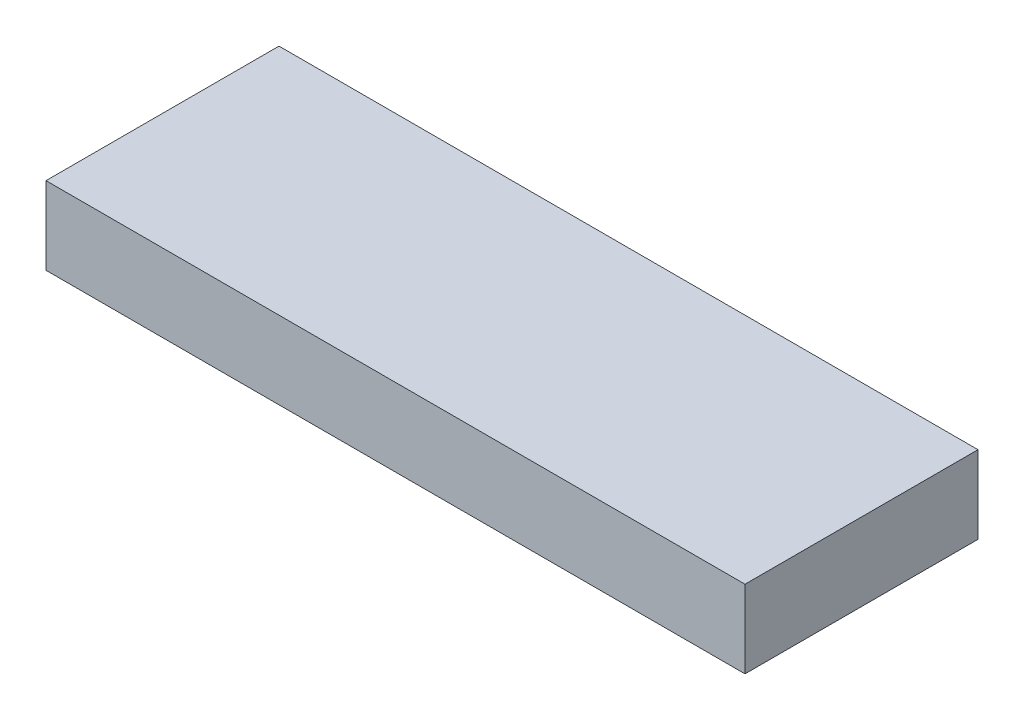
ISO-10303-21;
HEADER;
FILE_DESCRIPTION(('STEP AP214'),'2;1');
FILE_NAME('part.step','',(''),(''),'','','');
FILE_SCHEMA(('AUTOMOTIVE_DESIGN { 1 0 10303 214 1 1 1 1 }'));
ENDSEC;
DATA;
#1=APPLICATION_CONTEXT('core data for automotive mechanical design processes');
#2=APPLICATION_PROTOCOL_DEFINITION('international standard','automotive_design',2000,#1);
#3=PRODUCT_CONTEXT('',#1,'mechanical');
#4=PRODUCT('Part','Part','',(#3));
#5=PRODUCT_RELATED_PRODUCT_CATEGORY('part','',(#4));
#6=PRODUCT_DEFINITION_FORMATION('','',#4);
#7=PRODUCT_DEFINITION_CONTEXT('part definition',#1,'design');
#8=PRODUCT_DEFINITION('design','',#6,#7);
#9=PRODUCT_DEFINITION_SHAPE('','',#8);
#10=(LENGTH_UNIT() NAMED_UNIT(*) SI_UNIT(.MILLI.,.METRE.));
#11=(NAMED_UNIT(*) PLANE_ANGLE_UNIT() SI_UNIT($,.RADIAN.));
#12=(NAMED_UNIT(*) SI_UNIT($,.STERADIAN.) SOLID_ANGLE_UNIT());
#13=UNCERTAINTY_MEASURE_WITH_UNIT(LENGTH_MEASURE(1.E-05),#10,'distance_accuracy_value','');
#14=(GEOMETRIC_REPRESENTATION_CONTEXT(3) GLOBAL_UNCERTAINTY_ASSIGNED_CONTEXT((#13)) GLOBAL_UNIT_ASSIGNED_CONTEXT((#10,
#11,#12)) REPRESENTATION_CONTEXT('',''));
#15=CARTESIAN_POINT('',(0.,0.,0.));
#16=DIRECTION('',(0.,0.,1.));
#17=DIRECTION('',(1.,0.,0.));
#18=AXIS2_PLACEMENT_3D('',#15,#16,#17);
#19=CARTESIAN_POINT('',(0.,10.,30.));
#20=DIRECTION('',(0.,-1.,0.));
#21=DIRECTION('',(0.,0.,-1.));
#22=AXIS2_PLACEMENT_3D('',#19,#20,#21);
#23=PLANE('',#22);
#24=DIRECTION('',(0.,0.,-1.));
#25=VECTOR('',#24,1.);
#26=CARTESIAN_POINT('',(0.,10.,30.));
#27=LINE('',#26,#25);
#28=CARTESIAN_POINT('',(0.,10.,0.));
#29=VERTEX_POINT('',#28);
#30=CARTESIAN_POINT('',(0.,10.,30.));
#31=VERTEX_POINT('',#30);
#32=EDGE_CURVE('E20',#29,#31,#27,.F.);
#33=ORIENTED_EDGE('',*,*,#32,.T.);
#34=DIRECTION('',(-1.,0.,0.));
#35=VECTOR('',#34,1.);
#36=CARTESIAN_POINT('',(0.,10.,30.));
#37=LINE('',#36,#35);
#38=CARTESIAN_POINT('',(90.,10.,30.));
#39=VERTEX_POINT('',#38);
#40=EDGE_CURVE('E55',#31,#39,#37,.F.);
#41=ORIENTED_EDGE('',*,*,#40,.T.);
#42=DIRECTION('',(0.,0.,1.));
#43=VECTOR('',#42,1.);
#44=CARTESIAN_POINT('',(90.,10.,30.));
#45=LINE('',#44,#43);
#46=CARTESIAN_POINT('',(90.,10.,0.));
#47=VERTEX_POINT('',#46);
#48=EDGE_CURVE('E74',#39,#47,#45,.F.);
#49=ORIENTED_EDGE('',*,*,#48,.T.);
#50=DIRECTION('',(-1.,0.,0.));
#51=VECTOR('',#50,1.);
#52=CARTESIAN_POINT('',(0.,10.,0.));
#53=LINE('',#52,#51);
#54=EDGE_CURVE('E66',#29,#47,#53,.F.);
#55=ORIENTED_EDGE('',*,*,#54,.F.);
#56=EDGE_LOOP('',(#33,#41,#49,#55));
#57=FACE_BOUND('',#56,.T.);
#58=ADVANCED_FACE('F17',(#57),#23,.F.);
#59=CARTESIAN_POINT('',(0.,0.,30.));
#60=DIRECTION('',(1.,0.,0.));
#61=DIRECTION('',(0.,0.,-1.));
#62=AXIS2_PLACEMENT_3D('',#59,#60,#61);
#63=PLANE('',#62);
#64=DIRECTION('',(0.,0.,1.));
#65=VECTOR('',#64,1.);
#66=CARTESIAN_POINT('',(0.,0.,30.));
#67=LINE('',#66,#65);
#68=CARTESIAN_POINT('',(0.,0.,0.));
#69=VERTEX_POINT('',#68);
#70=CARTESIAN_POINT('',(0.,0.,30.));
#71=VERTEX_POINT('',#70);
#72=EDGE_CURVE('E72',#69,#71,#67,.T.);
#73=ORIENTED_EDGE('',*,*,#72,.T.);
#74=DIRECTION('',(0.,1.,0.));
#75=VECTOR('',#74,1.);
#76=CARTESIAN_POINT('',(0.,0.,30.));
#77=LINE('',#76,#75);
#78=EDGE_CURVE('E62',#71,#31,#77,.T.);
#79=ORIENTED_EDGE('',*,*,#78,.T.);
#80=ORIENTED_EDGE('',*,*,#32,.F.);
#81=DIRECTION('',(0.,1.,0.));
#82=VECTOR('',#81,1.);
#83=CARTESIAN_POINT('',(0.,0.,0.));
#84=LINE('',#83,#82);
#85=EDGE_CURVE('E78',#69,#29,#84,.T.);
#86=ORIENTED_EDGE('',*,*,#85,.F.);
#87=EDGE_LOOP('',(#73,#79,#80,#86));
#88=FACE_BOUND('',#87,.T.);
#89=ADVANCED_FACE('F71',(#88),#63,.F.);
#90=CARTESIAN_POINT('',(0.,0.,30.));
#91=DIRECTION('',(0.,0.,-1.));
#92=DIRECTION('',(-1.,0.,0.));
#93=AXIS2_PLACEMENT_3D('',#90,#91,#92);
#94=PLANE('',#93);
#95=DIRECTION('',(1.,0.,0.));
#96=VECTOR('',#95,1.);
#97=CARTESIAN_POINT('',(0.,0.,30.));
#98=LINE('',#97,#96);
#99=CARTESIAN_POINT('',(90.,0.,30.));
#100=VERTEX_POINT('',#99);
#101=EDGE_CURVE('E83',#71,#100,#98,.T.);
#102=ORIENTED_EDGE('',*,*,#101,.T.);
#103=DIRECTION('',(0.,1.,0.));
#104=VECTOR('',#103,1.);
#105=CARTESIAN_POINT('',(90.,0.,30.));
#106=LINE('',#105,#104);
#107=EDGE_CURVE('E64',#100,#39,#106,.T.);
#108=ORIENTED_EDGE('',*,*,#107,.T.);
#109=ORIENTED_EDGE('',*,*,#40,.F.);
#110=ORIENTED_EDGE('',*,*,#78,.F.);
#111=EDGE_LOOP('',(#102,#108,#109,#110));
#112=FACE_BOUND('',#111,.T.);
#113=ADVANCED_FACE('F60',(#112),#94,.F.);
#114=CARTESIAN_POINT('',(90.,0.,30.));
#115=DIRECTION('',(-1.,0.,0.));
#116=DIRECTION('',(0.,0.,1.));
#117=AXIS2_PLACEMENT_3D('',#114,#115,#116);
#118=PLANE('',#117);
#119=ORIENTED_EDGE('',*,*,#48,.F.);
#120=ORIENTED_EDGE('',*,*,#107,.F.);
#121=DIRECTION('',(0.,0.,1.));
#122=VECTOR('',#121,1.);
#123=CARTESIAN_POINT('',(90.,0.,30.));
#124=LINE('',#123,#122);
#125=CARTESIAN_POINT('',(90.,0.,0.));
#126=VERTEX_POINT('',#125);
#127=EDGE_CURVE('E26',#100,#126,#124,.F.);
#128=ORIENTED_EDGE('',*,*,#127,.T.);
#129=DIRECTION('',(0.,1.,0.));
#130=VECTOR('',#129,1.);
#131=CARTESIAN_POINT('',(90.,0.,0.));
#132=LINE('',#131,#130);
#133=EDGE_CURVE('E34',#47,#126,#132,.F.);
#134=ORIENTED_EDGE('',*,*,#133,.F.);
#135=EDGE_LOOP('',(#119,#120,#128,#134));
#136=FACE_BOUND('',#135,.T.);
#137=ADVANCED_FACE('F88',(#136),#118,.F.);
#138=CARTESIAN_POINT('',(0.,0.,0.));
#139=DIRECTION('',(0.,0.,-1.));
#140=DIRECTION('',(-1.,0.,0.));
#141=AXIS2_PLACEMENT_3D('',#138,#139,#140);
#142=PLANE('',#141);
#143=ORIENTED_EDGE('',*,*,#133,.T.);
#144=DIRECTION('',(1.,0.,0.));
#145=VECTOR('',#144,1.);
#146=CARTESIAN_POINT('',(0.,0.,0.));
#147=LINE('',#146,#145);
#148=EDGE_CURVE('E11',#126,#69,#147,.F.);
#149=ORIENTED_EDGE('',*,*,#148,.T.);
#150=ORIENTED_EDGE('',*,*,#85,.T.);
#151=ORIENTED_EDGE('',*,*,#54,.T.);
#152=EDGE_LOOP('',(#143,#149,#150,#151));
#153=FACE_BOUND('',#152,.T.);
#154=ADVANCED_FACE('F91',(#153),#142,.T.);
#155=CARTESIAN_POINT('',(0.,0.,30.));
#156=DIRECTION('',(0.,1.,0.));
#157=DIRECTION('',(0.,0.,1.));
#158=AXIS2_PLACEMENT_3D('',#155,#156,#157);
#159=PLANE('',#158);
#160=ORIENTED_EDGE('',*,*,#127,.F.);
#161=ORIENTED_EDGE('',*,*,#101,.F.);
#162=ORIENTED_EDGE('',*,*,#72,.F.);
#163=ORIENTED_EDGE('',*,*,#148,.F.);
#164=EDGE_LOOP('',(#160,#161,#162,#163));
#165=FACE_BOUND('',#164,.T.);
#166=ADVANCED_FACE('F90',(#165),#159,.F.);
#167=CLOSED_SHELL('',(#58,#89,#113,#137,#154,#166));
#168=MANIFOLD_SOLID_BREP('B1',#167);
#169=ADVANCED_BREP_SHAPE_REPRESENTATION('',(#18,#168),#14);
#170=SHAPE_DEFINITION_REPRESENTATION(#9,#169);
ENDSEC;
END-ISO-10303-21;
